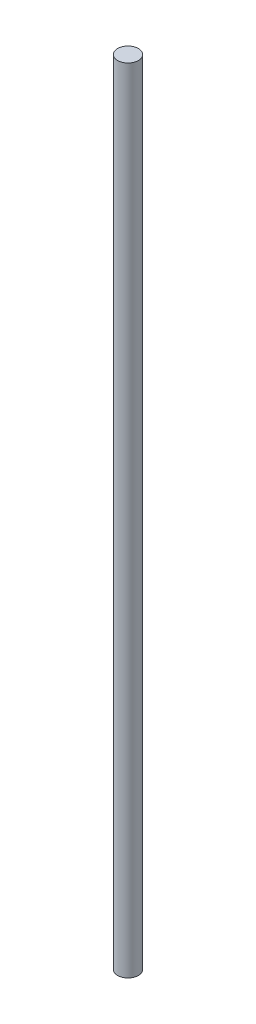
ISO-10303-21;
HEADER;
FILE_DESCRIPTION(('STEP AP214'),'2;1');
FILE_NAME('part.step','',(''),(''),'','','');
FILE_SCHEMA(('AUTOMOTIVE_DESIGN { 1 0 10303 214 1 1 1 1 }'));
ENDSEC;
DATA;
#1=APPLICATION_CONTEXT('core data for automotive mechanical design processes');
#2=APPLICATION_PROTOCOL_DEFINITION('international standard','automotive_design',2000,#1);
#3=PRODUCT_CONTEXT('',#1,'mechanical');
#4=PRODUCT('Part','Part','',(#3));
#5=PRODUCT_RELATED_PRODUCT_CATEGORY('part','',(#4));
#6=PRODUCT_DEFINITION_FORMATION('','',#4);
#7=PRODUCT_DEFINITION_CONTEXT('part definition',#1,'design');
#8=PRODUCT_DEFINITION('design','',#6,#7);
#9=PRODUCT_DEFINITION_SHAPE('','',#8);
#10=(LENGTH_UNIT() NAMED_UNIT(*) SI_UNIT(.MILLI.,.METRE.));
#11=(NAMED_UNIT(*) PLANE_ANGLE_UNIT() SI_UNIT($,.RADIAN.));
#12=(NAMED_UNIT(*) SI_UNIT($,.STERADIAN.) SOLID_ANGLE_UNIT());
#13=UNCERTAINTY_MEASURE_WITH_UNIT(LENGTH_MEASURE(1.E-05),#10,'distance_accuracy_value','');
#14=(GEOMETRIC_REPRESENTATION_CONTEXT(3) GLOBAL_UNCERTAINTY_ASSIGNED_CONTEXT((#13)) GLOBAL_UNIT_ASSIGNED_CONTEXT((#10,
#11,#12)) REPRESENTATION_CONTEXT('',''));
#15=CARTESIAN_POINT('',(0.,0.,0.));
#16=DIRECTION('',(0.,0.,1.));
#17=DIRECTION('',(1.,0.,0.));
#18=AXIS2_PLACEMENT_3D('',#15,#16,#17);
#19=CARTESIAN_POINT('',(0.,207.071067811866,0.));
#20=DIRECTION('',(0.,-1.,0.));
#21=DIRECTION('',(0.,0.,-1.));
#22=AXIS2_PLACEMENT_3D('',#19,#20,#21);
#23=CYLINDRICAL_SURFACE('',#22,2.5);
#24=CARTESIAN_POINT('',(0.,0.,0.));
#25=DIRECTION('',(0.,1.,0.));
#26=DIRECTION('',(0.,0.,1.));
#27=AXIS2_PLACEMENT_3D('',#24,#25,#26);
#28=CIRCLE('',#27,2.5);
#29=CARTESIAN_POINT('',(0.,0.,2.5));
#30=VERTEX_POINT('',#29);
#31=EDGE_CURVE('E40',#30,#30,#28,.T.);
#32=ORIENTED_EDGE('',*,*,#31,.T.);
#33=EDGE_LOOP('',(#32));
#34=FACE_BOUND('',#33,.T.);
#35=CARTESIAN_POINT('',(0.,190.,0.));
#36=DIRECTION('',(0.,1.,0.));
#37=DIRECTION('',(0.,0.,1.));
#38=AXIS2_PLACEMENT_3D('',#35,#36,#37);
#39=CIRCLE('',#38,2.5);
#40=CARTESIAN_POINT('',(0.,190.,2.5));
#41=VERTEX_POINT('',#40);
#42=EDGE_CURVE('E10',#41,#41,#39,.T.);
#43=ORIENTED_EDGE('',*,*,#42,.F.);
#44=EDGE_LOOP('',(#43));
#45=FACE_BOUND('',#44,.T.);
#46=ADVANCED_FACE('F33',(#34,#45),#23,.T.);
#47=CARTESIAN_POINT('',(0.,0.,0.));
#48=DIRECTION('',(0.,1.,0.));
#49=DIRECTION('',(0.,0.,1.));
#50=AXIS2_PLACEMENT_3D('',#47,#48,#49);
#51=PLANE('',#50);
#52=ORIENTED_EDGE('',*,*,#31,.F.);
#53=EDGE_LOOP('',(#52));
#54=FACE_BOUND('',#53,.T.);
#55=ADVANCED_FACE('F48',(#54),#51,.F.);
#56=CARTESIAN_POINT('',(42.8572754286412,190.,28.925103274786));
#57=DIRECTION('',(0.,1.,0.));
#58=DIRECTION('',(0.215697620679126,0.,-0.976460207296418));
#59=AXIS2_PLACEMENT_3D('',#56,#57,#58);
#60=PLANE('',#59);
#61=ORIENTED_EDGE('',*,*,#42,.T.);
#62=EDGE_LOOP('',(#61));
#63=FACE_BOUND('',#62,.T.);
#64=ADVANCED_FACE('F35',(#63),#60,.T.);
#65=CLOSED_SHELL('',(#46,#55,#64));
#66=MANIFOLD_SOLID_BREP('B2',#65);
#67=ADVANCED_BREP_SHAPE_REPRESENTATION('',(#18,#66),#14);
#68=SHAPE_DEFINITION_REPRESENTATION(#9,#67);
ENDSEC;
END-ISO-10303-21;
